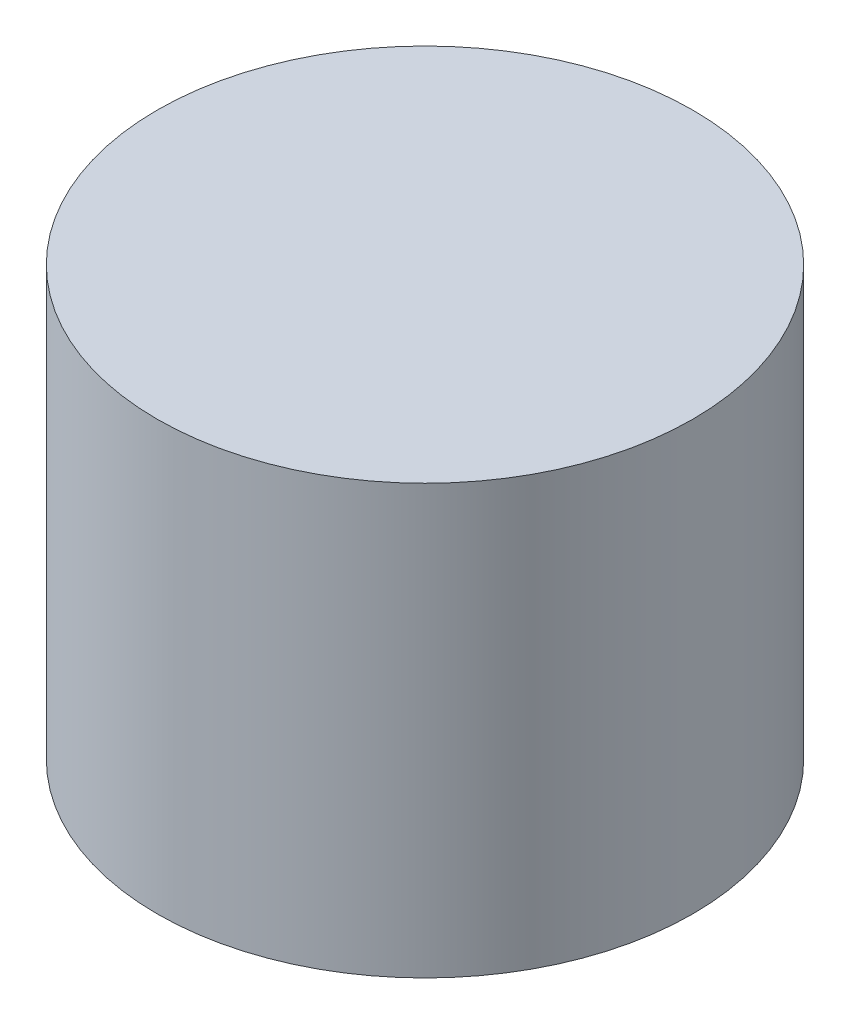
ISO-10303-21;
HEADER;
FILE_DESCRIPTION(('STEP AP214'),'2;1');
FILE_NAME('part.step','',(''),(''),'','','');
FILE_SCHEMA(('AUTOMOTIVE_DESIGN { 1 0 10303 214 1 1 1 1 }'));
ENDSEC;
DATA;
#1=APPLICATION_CONTEXT('core data for automotive mechanical design processes');
#2=APPLICATION_PROTOCOL_DEFINITION('international standard','automotive_design',2000,#1);
#3=PRODUCT_CONTEXT('',#1,'mechanical');
#4=PRODUCT('Part','Part','',(#3));
#5=PRODUCT_RELATED_PRODUCT_CATEGORY('part','',(#4));
#6=PRODUCT_DEFINITION_FORMATION('','',#4);
#7=PRODUCT_DEFINITION_CONTEXT('part definition',#1,'design');
#8=PRODUCT_DEFINITION('design','',#6,#7);
#9=PRODUCT_DEFINITION_SHAPE('','',#8);
#10=(LENGTH_UNIT() NAMED_UNIT(*) SI_UNIT(.MILLI.,.METRE.));
#11=(NAMED_UNIT(*) PLANE_ANGLE_UNIT() SI_UNIT($,.RADIAN.));
#12=(NAMED_UNIT(*) SI_UNIT($,.STERADIAN.) SOLID_ANGLE_UNIT());
#13=UNCERTAINTY_MEASURE_WITH_UNIT(LENGTH_MEASURE(1.E-05),#10,'distance_accuracy_value','');
#14=(GEOMETRIC_REPRESENTATION_CONTEXT(3) GLOBAL_UNCERTAINTY_ASSIGNED_CONTEXT((#13)) GLOBAL_UNIT_ASSIGNED_CONTEXT((#10,
#11,#12)) REPRESENTATION_CONTEXT('',''));
#15=CARTESIAN_POINT('',(0.,0.,0.));
#16=DIRECTION('',(0.,0.,1.));
#17=DIRECTION('',(1.,0.,0.));
#18=AXIS2_PLACEMENT_3D('',#15,#16,#17);
#19=CARTESIAN_POINT('',(0.,20.,0.));
#20=DIRECTION('',(0.,-1.,0.));
#21=DIRECTION('',(0.,0.,-1.));
#22=AXIS2_PLACEMENT_3D('',#19,#20,#21);
#23=CYLINDRICAL_SURFACE('',#22,12.5);
#24=CARTESIAN_POINT('',(0.,20.,0.));
#25=DIRECTION('',(0.,1.,0.));
#26=DIRECTION('',(0.,0.,1.));
#27=AXIS2_PLACEMENT_3D('',#24,#25,#26);
#28=CIRCLE('',#27,12.5);
#29=CARTESIAN_POINT('',(0.,20.,12.5));
#30=VERTEX_POINT('',#29);
#31=EDGE_CURVE('E10',#30,#30,#28,.T.);
#32=ORIENTED_EDGE('',*,*,#31,.F.);
#33=EDGE_LOOP('',(#32));
#34=FACE_BOUND('',#33,.T.);
#35=CARTESIAN_POINT('',(0.,0.,0.));
#36=DIRECTION('',(0.,1.,0.));
#37=DIRECTION('',(0.,0.,1.));
#38=AXIS2_PLACEMENT_3D('',#35,#36,#37);
#39=CIRCLE('',#38,12.5);
#40=CARTESIAN_POINT('',(0.,0.,12.5));
#41=VERTEX_POINT('',#40);
#42=EDGE_CURVE('E42',#41,#41,#39,.T.);
#43=ORIENTED_EDGE('',*,*,#42,.T.);
#44=EDGE_LOOP('',(#43));
#45=FACE_BOUND('',#44,.T.);
#46=ADVANCED_FACE('F39',(#34,#45),#23,.T.);
#47=CARTESIAN_POINT('',(0.,20.,0.));
#48=DIRECTION('',(0.,1.,0.));
#49=DIRECTION('',(0.,0.,1.));
#50=AXIS2_PLACEMENT_3D('',#47,#48,#49);
#51=PLANE('',#50);
#52=ORIENTED_EDGE('',*,*,#31,.T.);
#53=EDGE_LOOP('',(#52));
#54=FACE_BOUND('',#53,.T.);
#55=ADVANCED_FACE('F54',(#54),#51,.T.);
#56=CARTESIAN_POINT('',(0.,0.,0.));
#57=DIRECTION('',(0.,1.,0.));
#58=DIRECTION('',(0.,0.,1.));
#59=AXIS2_PLACEMENT_3D('',#56,#57,#58);
#60=PLANE('',#59);
#61=ORIENTED_EDGE('',*,*,#42,.F.);
#62=EDGE_LOOP('',(#61));
#63=FACE_BOUND('',#62,.T.);
#64=ADVANCED_FACE('F52',(#63),#60,.F.);
#65=CLOSED_SHELL('',(#46,#55,#64));
#66=MANIFOLD_SOLID_BREP('B2',#65);
#67=ADVANCED_BREP_SHAPE_REPRESENTATION('',(#18,#66),#14);
#68=SHAPE_DEFINITION_REPRESENTATION(#9,#67);
ENDSEC;
END-ISO-10303-21;
